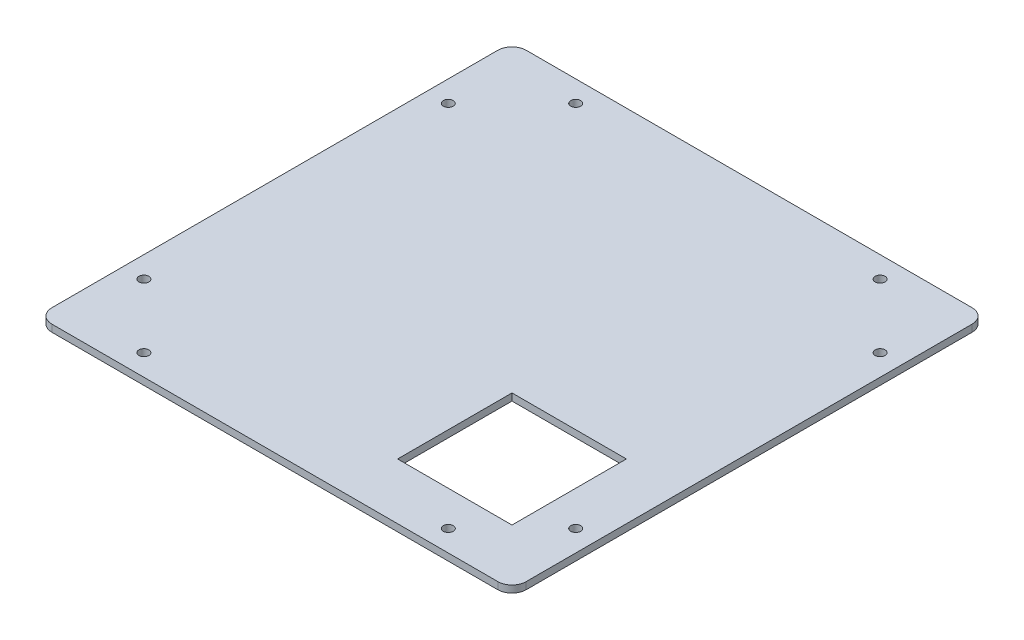
ISO-10303-21;
HEADER;
FILE_DESCRIPTION(('STEP AP214'),'2;1');
FILE_NAME('part.step','',(''),(''),'','','');
FILE_SCHEMA(('AUTOMOTIVE_DESIGN { 1 0 10303 214 1 1 1 1 }'));
ENDSEC;
DATA;
#1=APPLICATION_CONTEXT('core data for automotive mechanical design processes');
#2=APPLICATION_PROTOCOL_DEFINITION('international standard','automotive_design',2000,#1);
#3=PRODUCT_CONTEXT('',#1,'mechanical');
#4=PRODUCT('Part','Part','',(#3));
#5=PRODUCT_RELATED_PRODUCT_CATEGORY('part','',(#4));
#6=PRODUCT_DEFINITION_FORMATION('','',#4);
#7=PRODUCT_DEFINITION_CONTEXT('part definition',#1,'design');
#8=PRODUCT_DEFINITION('design','',#6,#7);
#9=PRODUCT_DEFINITION_SHAPE('','',#8);
#10=(LENGTH_UNIT() NAMED_UNIT(*) SI_UNIT(.MILLI.,.METRE.));
#11=(NAMED_UNIT(*) PLANE_ANGLE_UNIT() SI_UNIT($,.RADIAN.));
#12=(NAMED_UNIT(*) SI_UNIT($,.STERADIAN.) SOLID_ANGLE_UNIT());
#13=UNCERTAINTY_MEASURE_WITH_UNIT(LENGTH_MEASURE(1.E-05),#10,'distance_accuracy_value','');
#14=(GEOMETRIC_REPRESENTATION_CONTEXT(3) GLOBAL_UNCERTAINTY_ASSIGNED_CONTEXT((#13)) GLOBAL_UNIT_ASSIGNED_CONTEXT((#10,
#11,#12)) REPRESENTATION_CONTEXT('',''));
#15=CARTESIAN_POINT('',(0.,0.,0.));
#16=DIRECTION('',(0.,0.,1.));
#17=DIRECTION('',(1.,0.,0.));
#18=AXIS2_PLACEMENT_3D('',#15,#16,#17);
#19=CARTESIAN_POINT('',(212.725,6.35,212.725));
#20=DIRECTION('',(-1.,0.,0.));
#21=DIRECTION('',(0.,0.,1.));
#22=AXIS2_PLACEMENT_3D('',#19,#20,#21);
#23=PLANE('',#22);
#24=DIRECTION('',(0.,0.,-1.));
#25=VECTOR('',#24,1.);
#26=CARTESIAN_POINT('',(212.725,6.35,212.725));
#27=LINE('',#26,#25);
#28=CARTESIAN_POINT('',(212.725,6.35,200.025));
#29=VERTEX_POINT('',#28);
#30=CARTESIAN_POINT('',(212.725,6.35,-200.025));
#31=VERTEX_POINT('',#30);
#32=EDGE_CURVE('E217',#29,#31,#27,.T.);
#33=ORIENTED_EDGE('',*,*,#32,.F.);
#34=DIRECTION('',(0.,-1.,0.));
#35=VECTOR('',#34,1.);
#36=CARTESIAN_POINT('',(212.725,6.35,200.025));
#37=LINE('',#36,#35);
#38=CARTESIAN_POINT('',(212.725,0.,200.025));
#39=VERTEX_POINT('',#38);
#40=EDGE_CURVE('E239',#29,#39,#37,.T.);
#41=ORIENTED_EDGE('',*,*,#40,.T.);
#42=DIRECTION('',(0.,0.,-1.));
#43=VECTOR('',#42,1.);
#44=CARTESIAN_POINT('',(212.725,0.,212.725));
#45=LINE('',#44,#43);
#46=CARTESIAN_POINT('',(212.725,0.,-200.025));
#47=VERTEX_POINT('',#46);
#48=EDGE_CURVE('E214',#39,#47,#45,.T.);
#49=ORIENTED_EDGE('',*,*,#48,.T.);
#50=DIRECTION('',(0.,-1.,0.));
#51=VECTOR('',#50,1.);
#52=CARTESIAN_POINT('',(212.725,6.35,-200.025));
#53=LINE('',#52,#51);
#54=EDGE_CURVE('E228',#47,#31,#53,.F.);
#55=ORIENTED_EDGE('',*,*,#54,.T.);
#56=EDGE_LOOP('',(#33,#41,#49,#55));
#57=FACE_BOUND('',#56,.T.);
#58=ADVANCED_FACE('F35',(#57),#23,.F.);
#59=CARTESIAN_POINT('',(-212.725,6.35,-212.725));
#60=DIRECTION('',(0.,0.,1.));
#61=DIRECTION('',(1.,0.,0.));
#62=AXIS2_PLACEMENT_3D('',#59,#60,#61);
#63=PLANE('',#62);
#64=DIRECTION('',(-1.,0.,0.));
#65=VECTOR('',#64,1.);
#66=CARTESIAN_POINT('',(-212.725,6.35,-212.725));
#67=LINE('',#66,#65);
#68=CARTESIAN_POINT('',(200.025,6.35,-212.725));
#69=VERTEX_POINT('',#68);
#70=CARTESIAN_POINT('',(-200.025,6.35,-212.725));
#71=VERTEX_POINT('',#70);
#72=EDGE_CURVE('E220',#69,#71,#67,.T.);
#73=ORIENTED_EDGE('',*,*,#72,.F.);
#74=DIRECTION('',(0.,-1.,0.));
#75=VECTOR('',#74,1.);
#76=CARTESIAN_POINT('',(200.025,6.35,-212.725));
#77=LINE('',#76,#75);
#78=CARTESIAN_POINT('',(200.025,0.,-212.725));
#79=VERTEX_POINT('',#78);
#80=EDGE_CURVE('E264',#69,#79,#77,.T.);
#81=ORIENTED_EDGE('',*,*,#80,.T.);
#82=DIRECTION('',(-1.,0.,0.));
#83=VECTOR('',#82,1.);
#84=CARTESIAN_POINT('',(-212.725,0.,-212.725));
#85=LINE('',#84,#83);
#86=CARTESIAN_POINT('',(-200.025,0.,-212.725));
#87=VERTEX_POINT('',#86);
#88=EDGE_CURVE('E231',#79,#87,#85,.T.);
#89=ORIENTED_EDGE('',*,*,#88,.T.);
#90=DIRECTION('',(0.,-1.,0.));
#91=VECTOR('',#90,1.);
#92=CARTESIAN_POINT('',(-200.025,6.35,-212.725));
#93=LINE('',#92,#91);
#94=EDGE_CURVE('E262',#87,#71,#93,.F.);
#95=ORIENTED_EDGE('',*,*,#94,.T.);
#96=EDGE_LOOP('',(#73,#81,#89,#95));
#97=FACE_BOUND('',#96,.T.);
#98=ADVANCED_FACE('F270',(#97),#63,.F.);
#99=CARTESIAN_POINT('',(-212.725,6.35,212.725));
#100=DIRECTION('',(1.,0.,0.));
#101=DIRECTION('',(0.,0.,-1.));
#102=AXIS2_PLACEMENT_3D('',#99,#100,#101);
#103=PLANE('',#102);
#104=DIRECTION('',(0.,0.,1.));
#105=VECTOR('',#104,1.);
#106=CARTESIAN_POINT('',(-212.725,6.35,212.725));
#107=LINE('',#106,#105);
#108=CARTESIAN_POINT('',(-212.725,6.35,-200.025));
#109=VERTEX_POINT('',#108);
#110=CARTESIAN_POINT('',(-212.725,6.35,200.025));
#111=VERTEX_POINT('',#110);
#112=EDGE_CURVE('E223',#109,#111,#107,.T.);
#113=ORIENTED_EDGE('',*,*,#112,.F.);
#114=DIRECTION('',(0.,-1.,0.));
#115=VECTOR('',#114,1.);
#116=CARTESIAN_POINT('',(-212.725,6.35,-200.025));
#117=LINE('',#116,#115);
#118=CARTESIAN_POINT('',(-212.725,0.,-200.025));
#119=VERTEX_POINT('',#118);
#120=EDGE_CURVE('E11',#109,#119,#117,.T.);
#121=ORIENTED_EDGE('',*,*,#120,.T.);
#122=DIRECTION('',(0.,0.,1.));
#123=VECTOR('',#122,1.);
#124=CARTESIAN_POINT('',(-212.725,0.,212.725));
#125=LINE('',#124,#123);
#126=CARTESIAN_POINT('',(-212.725,0.,200.025));
#127=VERTEX_POINT('',#126);
#128=EDGE_CURVE('E234',#119,#127,#125,.T.);
#129=ORIENTED_EDGE('',*,*,#128,.T.);
#130=DIRECTION('',(0.,-1.,0.));
#131=VECTOR('',#130,1.);
#132=CARTESIAN_POINT('',(-212.725,6.35,200.025));
#133=LINE('',#132,#131);
#134=EDGE_CURVE('E43',#127,#111,#133,.F.);
#135=ORIENTED_EDGE('',*,*,#134,.T.);
#136=EDGE_LOOP('',(#113,#121,#129,#135));
#137=FACE_BOUND('',#136,.T.);
#138=ADVANCED_FACE('F280',(#137),#103,.F.);
#139=CARTESIAN_POINT('',(-212.725,6.35,212.725));
#140=DIRECTION('',(0.,0.,-1.));
#141=DIRECTION('',(-1.,0.,0.));
#142=AXIS2_PLACEMENT_3D('',#139,#140,#141);
#143=PLANE('',#142);
#144=DIRECTION('',(1.,0.,0.));
#145=VECTOR('',#144,1.);
#146=CARTESIAN_POINT('',(-212.725,0.,212.725));
#147=LINE('',#146,#145);
#148=CARTESIAN_POINT('',(-200.025,0.,212.725));
#149=VERTEX_POINT('',#148);
#150=CARTESIAN_POINT('',(200.025,0.,212.725));
#151=VERTEX_POINT('',#150);
#152=EDGE_CURVE('E221',#149,#151,#147,.T.);
#153=ORIENTED_EDGE('',*,*,#152,.T.);
#154=DIRECTION('',(0.,-1.,0.));
#155=VECTOR('',#154,1.);
#156=CARTESIAN_POINT('',(200.025,6.35,212.725));
#157=LINE('',#156,#155);
#158=CARTESIAN_POINT('',(200.025,6.35,212.725));
#159=VERTEX_POINT('',#158);
#160=EDGE_CURVE('E253',#151,#159,#157,.F.);
#161=ORIENTED_EDGE('',*,*,#160,.T.);
#162=DIRECTION('',(1.,0.,0.));
#163=VECTOR('',#162,1.);
#164=CARTESIAN_POINT('',(-212.725,6.35,212.725));
#165=LINE('',#164,#163);
#166=CARTESIAN_POINT('',(-200.025,6.35,212.725));
#167=VERTEX_POINT('',#166);
#168=EDGE_CURVE('E225',#167,#159,#165,.T.);
#169=ORIENTED_EDGE('',*,*,#168,.F.);
#170=DIRECTION('',(0.,-1.,0.));
#171=VECTOR('',#170,1.);
#172=CARTESIAN_POINT('',(-200.025,6.35,212.725));
#173=LINE('',#172,#171);
#174=EDGE_CURVE('E250',#167,#149,#173,.T.);
#175=ORIENTED_EDGE('',*,*,#174,.T.);
#176=EDGE_LOOP('',(#153,#161,#169,#175));
#177=FACE_BOUND('',#176,.T.);
#178=ADVANCED_FACE('F288',(#177),#143,.F.);
#179=CARTESIAN_POINT('',(0.,6.35,0.));
#180=DIRECTION('',(0.,-1.,0.));
#181=DIRECTION('',(0.,0.,-1.));
#182=AXIS2_PLACEMENT_3D('',#179,#180,#181);
#183=PLANE('',#182);
#184=DIRECTION('',(-1.,0.,0.));
#185=VECTOR('',#184,1.);
#186=CARTESIAN_POINT('',(59.817,6.35,59.817));
#187=LINE('',#186,#185);
#188=CARTESIAN_POINT('',(162.433,6.35,59.817));
#189=VERTEX_POINT('',#188);
#190=CARTESIAN_POINT('',(59.817,6.35,59.817));
#191=VERTEX_POINT('',#190);
#192=EDGE_CURVE('E159',#189,#191,#187,.T.);
#193=ORIENTED_EDGE('',*,*,#192,.F.);
#194=DIRECTION('',(0.,0.,-1.));
#195=VECTOR('',#194,1.);
#196=CARTESIAN_POINT('',(162.433,6.35,59.817));
#197=LINE('',#196,#195);
#198=CARTESIAN_POINT('',(162.433,6.35,162.433));
#199=VERTEX_POINT('',#198);
#200=EDGE_CURVE('E132',#199,#189,#197,.T.);
#201=ORIENTED_EDGE('',*,*,#200,.F.);
#202=DIRECTION('',(1.,0.,0.));
#203=VECTOR('',#202,1.);
#204=CARTESIAN_POINT('',(59.817,6.35,162.433));
#205=LINE('',#204,#203);
#206=CARTESIAN_POINT('',(59.817,6.35,162.433));
#207=VERTEX_POINT('',#206);
#208=EDGE_CURVE('E150',#207,#199,#205,.T.);
#209=ORIENTED_EDGE('',*,*,#208,.F.);
#210=DIRECTION('',(0.,0.,1.));
#211=VECTOR('',#210,1.);
#212=CARTESIAN_POINT('',(59.817,6.35,59.817));
#213=LINE('',#212,#211);
#214=EDGE_CURVE('E153',#191,#207,#213,.T.);
#215=ORIENTED_EDGE('',*,*,#214,.F.);
#216=EDGE_LOOP('',(#193,#201,#209,#215));
#217=FACE_BOUND('',#216,.T.);
#218=CARTESIAN_POINT('',(-136.525,6.35,-193.675));
#219=DIRECTION('',(0.,1.,0.));
#220=DIRECTION('',(0.,0.,-1.));
#221=AXIS2_PLACEMENT_3D('',#218,#219,#220);
#222=CIRCLE('',#221,4.445);
#223=CARTESIAN_POINT('',(-136.525,6.35,-198.12));
#224=VERTEX_POINT('',#223);
#225=EDGE_CURVE('E165',#224,#224,#222,.T.);
#226=ORIENTED_EDGE('',*,*,#225,.F.);
#227=EDGE_LOOP('',(#226));
#228=FACE_BOUND('',#227,.T.);
#229=CARTESIAN_POINT('',(136.525,6.35,-193.675));
#230=DIRECTION('',(0.,1.,0.));
#231=DIRECTION('',(0.,0.,-1.));
#232=AXIS2_PLACEMENT_3D('',#229,#230,#231);
#233=CIRCLE('',#232,4.44499999999997);
#234=CARTESIAN_POINT('',(136.525,6.35,-198.12));
#235=VERTEX_POINT('',#234);
#236=EDGE_CURVE('E185',#235,#235,#233,.T.);
#237=ORIENTED_EDGE('',*,*,#236,.F.);
#238=EDGE_LOOP('',(#237));
#239=FACE_BOUND('',#238,.T.);
#240=CARTESIAN_POINT('',(193.675,6.35,-136.525));
#241=DIRECTION('',(0.,1.,0.));
#242=DIRECTION('',(0.,0.,-1.));
#243=AXIS2_PLACEMENT_3D('',#240,#241,#242);
#244=CIRCLE('',#243,4.44499999999992);
#245=CARTESIAN_POINT('',(193.675,6.35,-140.97));
#246=VERTEX_POINT('',#245);
#247=EDGE_CURVE('E179',#246,#246,#244,.T.);
#248=ORIENTED_EDGE('',*,*,#247,.F.);
#249=EDGE_LOOP('',(#248));
#250=FACE_BOUND('',#249,.T.);
#251=CARTESIAN_POINT('',(193.675,6.35,136.525));
#252=DIRECTION('',(0.,1.,0.));
#253=DIRECTION('',(0.,0.,-1.));
#254=AXIS2_PLACEMENT_3D('',#251,#252,#253);
#255=CIRCLE('',#254,4.44499999999993);
#256=CARTESIAN_POINT('',(193.675,6.35,132.08));
#257=VERTEX_POINT('',#256);
#258=EDGE_CURVE('E173',#257,#257,#255,.T.);
#259=ORIENTED_EDGE('',*,*,#258,.F.);
#260=EDGE_LOOP('',(#259));
#261=FACE_BOUND('',#260,.T.);
#262=CARTESIAN_POINT('',(136.525,6.35,193.675));
#263=DIRECTION('',(0.,1.,0.));
#264=DIRECTION('',(0.,0.,1.));
#265=AXIS2_PLACEMENT_3D('',#262,#263,#264);
#266=CIRCLE('',#265,4.445);
#267=CARTESIAN_POINT('',(136.525,6.35,198.12));
#268=VERTEX_POINT('',#267);
#269=EDGE_CURVE('E172',#268,#268,#266,.T.);
#270=ORIENTED_EDGE('',*,*,#269,.F.);
#271=EDGE_LOOP('',(#270));
#272=FACE_BOUND('',#271,.T.);
#273=CARTESIAN_POINT('',(-136.525,6.35,193.675));
#274=DIRECTION('',(0.,1.,0.));
#275=DIRECTION('',(0.,0.,1.));
#276=AXIS2_PLACEMENT_3D('',#273,#274,#275);
#277=CIRCLE('',#276,4.445);
#278=CARTESIAN_POINT('',(-136.525,6.35,198.12));
#279=VERTEX_POINT('',#278);
#280=EDGE_CURVE('E203',#279,#279,#277,.T.);
#281=ORIENTED_EDGE('',*,*,#280,.F.);
#282=EDGE_LOOP('',(#281));
#283=FACE_BOUND('',#282,.T.);
#284=CARTESIAN_POINT('',(-193.675,6.35,136.525));
#285=DIRECTION('',(0.,1.,0.));
#286=DIRECTION('',(0.,0.,1.));
#287=AXIS2_PLACEMENT_3D('',#284,#285,#286);
#288=CIRCLE('',#287,4.445);
#289=CARTESIAN_POINT('',(-193.675,6.35,140.97));
#290=VERTEX_POINT('',#289);
#291=EDGE_CURVE('E197',#290,#290,#288,.T.);
#292=ORIENTED_EDGE('',*,*,#291,.F.);
#293=EDGE_LOOP('',(#292));
#294=FACE_BOUND('',#293,.T.);
#295=CARTESIAN_POINT('',(-193.675,6.35,-136.525));
#296=DIRECTION('',(0.,1.,0.));
#297=DIRECTION('',(0.,0.,1.));
#298=AXIS2_PLACEMENT_3D('',#295,#296,#297);
#299=CIRCLE('',#298,4.445);
#300=CARTESIAN_POINT('',(-193.675,6.35,-132.08));
#301=VERTEX_POINT('',#300);
#302=EDGE_CURVE('E196',#301,#301,#299,.T.);
#303=ORIENTED_EDGE('',*,*,#302,.F.);
#304=EDGE_LOOP('',(#303));
#305=FACE_BOUND('',#304,.T.);
#306=ORIENTED_EDGE('',*,*,#168,.T.);
#307=CARTESIAN_POINT('',(200.025,6.35,200.025));
#308=DIRECTION('',(0.,-1.,0.));
#309=DIRECTION('',(0.,0.,-1.));
#310=AXIS2_PLACEMENT_3D('',#307,#308,#309);
#311=CIRCLE('',#310,12.7);
#312=EDGE_CURVE('E260',#159,#29,#311,.F.);
#313=ORIENTED_EDGE('',*,*,#312,.T.);
#314=ORIENTED_EDGE('',*,*,#32,.T.);
#315=CARTESIAN_POINT('',(200.025,6.35,-200.025));
#316=DIRECTION('',(0.,-1.,0.));
#317=DIRECTION('',(0.,0.,-1.));
#318=AXIS2_PLACEMENT_3D('',#315,#316,#317);
#319=CIRCLE('',#318,12.7);
#320=EDGE_CURVE('E258',#31,#69,#319,.F.);
#321=ORIENTED_EDGE('',*,*,#320,.T.);
#322=ORIENTED_EDGE('',*,*,#72,.T.);
#323=CARTESIAN_POINT('',(-200.025,6.35,-200.025));
#324=DIRECTION('',(0.,-1.,0.));
#325=DIRECTION('',(0.,0.,-1.));
#326=AXIS2_PLACEMENT_3D('',#323,#324,#325);
#327=CIRCLE('',#326,12.7);
#328=EDGE_CURVE('E56',#71,#109,#327,.F.);
#329=ORIENTED_EDGE('',*,*,#328,.T.);
#330=ORIENTED_EDGE('',*,*,#112,.T.);
#331=CARTESIAN_POINT('',(-200.025,6.35,200.025));
#332=DIRECTION('',(0.,-1.,0.));
#333=DIRECTION('',(0.,0.,-1.));
#334=AXIS2_PLACEMENT_3D('',#331,#332,#333);
#335=CIRCLE('',#334,12.7);
#336=EDGE_CURVE('E255',#111,#167,#335,.F.);
#337=ORIENTED_EDGE('',*,*,#336,.T.);
#338=EDGE_LOOP('',(#306,#313,#314,#321,#322,#329,#330,#337));
#339=FACE_BOUND('',#338,.T.);
#340=ADVANCED_FACE('F282',(#217,#228,#239,#250,#261,#272,#283,#294,#305,#339),#183,.F.);
#341=CARTESIAN_POINT('',(0.,0.,0.));
#342=DIRECTION('',(0.,-1.,0.));
#343=DIRECTION('',(0.,0.,-1.));
#344=AXIS2_PLACEMENT_3D('',#341,#342,#343);
#345=PLANE('',#344);
#346=DIRECTION('',(0.,0.,-1.));
#347=VECTOR('',#346,1.);
#348=CARTESIAN_POINT('',(162.433,0.,59.817));
#349=LINE('',#348,#347);
#350=CARTESIAN_POINT('',(162.433,0.,162.433));
#351=VERTEX_POINT('',#350);
#352=CARTESIAN_POINT('',(162.433,0.,59.817));
#353=VERTEX_POINT('',#352);
#354=EDGE_CURVE('E129',#351,#353,#349,.T.);
#355=ORIENTED_EDGE('',*,*,#354,.T.);
#356=DIRECTION('',(-1.,0.,0.));
#357=VECTOR('',#356,1.);
#358=CARTESIAN_POINT('',(59.817,0.,59.817));
#359=LINE('',#358,#357);
#360=CARTESIAN_POINT('',(59.817,0.,59.817));
#361=VERTEX_POINT('',#360);
#362=EDGE_CURVE('E141',#353,#361,#359,.T.);
#363=ORIENTED_EDGE('',*,*,#362,.T.);
#364=DIRECTION('',(0.,0.,1.));
#365=VECTOR('',#364,1.);
#366=CARTESIAN_POINT('',(59.817,0.,59.817));
#367=LINE('',#366,#365);
#368=CARTESIAN_POINT('',(59.817,0.,162.433));
#369=VERTEX_POINT('',#368);
#370=EDGE_CURVE('E145',#361,#369,#367,.T.);
#371=ORIENTED_EDGE('',*,*,#370,.T.);
#372=DIRECTION('',(1.,0.,0.));
#373=VECTOR('',#372,1.);
#374=CARTESIAN_POINT('',(59.817,0.,162.433));
#375=LINE('',#374,#373);
#376=EDGE_CURVE('E137',#369,#351,#375,.T.);
#377=ORIENTED_EDGE('',*,*,#376,.T.);
#378=EDGE_LOOP('',(#355,#363,#371,#377));
#379=FACE_BOUND('',#378,.T.);
#380=CARTESIAN_POINT('',(-136.525,0.,-193.675));
#381=DIRECTION('',(0.,1.,0.));
#382=DIRECTION('',(0.,0.,-1.));
#383=AXIS2_PLACEMENT_3D('',#380,#381,#382);
#384=CIRCLE('',#383,4.445);
#385=CARTESIAN_POINT('',(-136.525,0.,-198.12));
#386=VERTEX_POINT('',#385);
#387=EDGE_CURVE('E188',#386,#386,#384,.T.);
#388=ORIENTED_EDGE('',*,*,#387,.T.);
#389=EDGE_LOOP('',(#388));
#390=FACE_BOUND('',#389,.T.);
#391=CARTESIAN_POINT('',(136.525,0.,-193.675));
#392=DIRECTION('',(0.,1.,0.));
#393=DIRECTION('',(0.,0.,-1.));
#394=AXIS2_PLACEMENT_3D('',#391,#392,#393);
#395=CIRCLE('',#394,4.44499999999997);
#396=CARTESIAN_POINT('',(136.525,0.,-198.12));
#397=VERTEX_POINT('',#396);
#398=EDGE_CURVE('E182',#397,#397,#395,.T.);
#399=ORIENTED_EDGE('',*,*,#398,.T.);
#400=EDGE_LOOP('',(#399));
#401=FACE_BOUND('',#400,.T.);
#402=CARTESIAN_POINT('',(193.675,0.,-136.525));
#403=DIRECTION('',(0.,1.,0.));
#404=DIRECTION('',(0.,0.,-1.));
#405=AXIS2_PLACEMENT_3D('',#402,#403,#404);
#406=CIRCLE('',#405,4.44499999999992);
#407=CARTESIAN_POINT('',(193.675,0.,-140.97));
#408=VERTEX_POINT('',#407);
#409=EDGE_CURVE('E176',#408,#408,#406,.T.);
#410=ORIENTED_EDGE('',*,*,#409,.T.);
#411=EDGE_LOOP('',(#410));
#412=FACE_BOUND('',#411,.T.);
#413=CARTESIAN_POINT('',(193.675,0.,136.525));
#414=DIRECTION('',(0.,1.,0.));
#415=DIRECTION('',(0.,0.,-1.));
#416=AXIS2_PLACEMENT_3D('',#413,#414,#415);
#417=CIRCLE('',#416,4.44499999999993);
#418=CARTESIAN_POINT('',(193.675,0.,132.08));
#419=VERTEX_POINT('',#418);
#420=EDGE_CURVE('E169',#419,#419,#417,.T.);
#421=ORIENTED_EDGE('',*,*,#420,.T.);
#422=EDGE_LOOP('',(#421));
#423=FACE_BOUND('',#422,.T.);
#424=CARTESIAN_POINT('',(136.525,0.,193.675));
#425=DIRECTION('',(0.,1.,0.));
#426=DIRECTION('',(0.,0.,1.));
#427=AXIS2_PLACEMENT_3D('',#424,#425,#426);
#428=CIRCLE('',#427,4.445);
#429=CARTESIAN_POINT('',(136.525,0.,198.12));
#430=VERTEX_POINT('',#429);
#431=EDGE_CURVE('E206',#430,#430,#428,.T.);
#432=ORIENTED_EDGE('',*,*,#431,.T.);
#433=EDGE_LOOP('',(#432));
#434=FACE_BOUND('',#433,.T.);
#435=CARTESIAN_POINT('',(-136.525,0.,193.675));
#436=DIRECTION('',(0.,1.,0.));
#437=DIRECTION('',(0.,0.,1.));
#438=AXIS2_PLACEMENT_3D('',#435,#436,#437);
#439=CIRCLE('',#438,4.445);
#440=CARTESIAN_POINT('',(-136.525,0.,198.12));
#441=VERTEX_POINT('',#440);
#442=EDGE_CURVE('E200',#441,#441,#439,.T.);
#443=ORIENTED_EDGE('',*,*,#442,.T.);
#444=EDGE_LOOP('',(#443));
#445=FACE_BOUND('',#444,.T.);
#446=CARTESIAN_POINT('',(-193.675,0.,136.525));
#447=DIRECTION('',(0.,1.,0.));
#448=DIRECTION('',(0.,0.,1.));
#449=AXIS2_PLACEMENT_3D('',#446,#447,#448);
#450=CIRCLE('',#449,4.445);
#451=CARTESIAN_POINT('',(-193.675,0.,140.97));
#452=VERTEX_POINT('',#451);
#453=EDGE_CURVE('E193',#452,#452,#450,.T.);
#454=ORIENTED_EDGE('',*,*,#453,.T.);
#455=EDGE_LOOP('',(#454));
#456=FACE_BOUND('',#455,.T.);
#457=CARTESIAN_POINT('',(-193.675,0.,-136.525));
#458=DIRECTION('',(0.,1.,0.));
#459=DIRECTION('',(0.,0.,1.));
#460=AXIS2_PLACEMENT_3D('',#457,#458,#459);
#461=CIRCLE('',#460,4.445);
#462=CARTESIAN_POINT('',(-193.675,0.,-132.08));
#463=VERTEX_POINT('',#462);
#464=EDGE_CURVE('E211',#463,#463,#461,.T.);
#465=ORIENTED_EDGE('',*,*,#464,.T.);
#466=EDGE_LOOP('',(#465));
#467=FACE_BOUND('',#466,.T.);
#468=ORIENTED_EDGE('',*,*,#48,.F.);
#469=CARTESIAN_POINT('',(200.025,0.,200.025));
#470=DIRECTION('',(0.,-1.,0.));
#471=DIRECTION('',(0.,0.,-1.));
#472=AXIS2_PLACEMENT_3D('',#469,#470,#471);
#473=CIRCLE('',#472,12.7);
#474=EDGE_CURVE('E248',#39,#151,#473,.T.);
#475=ORIENTED_EDGE('',*,*,#474,.T.);
#476=ORIENTED_EDGE('',*,*,#152,.F.);
#477=CARTESIAN_POINT('',(-200.025,0.,200.025));
#478=DIRECTION('',(0.,-1.,0.));
#479=DIRECTION('',(0.,0.,-1.));
#480=AXIS2_PLACEMENT_3D('',#477,#478,#479);
#481=CIRCLE('',#480,12.7);
#482=EDGE_CURVE('E242',#149,#127,#481,.T.);
#483=ORIENTED_EDGE('',*,*,#482,.T.);
#484=ORIENTED_EDGE('',*,*,#128,.F.);
#485=CARTESIAN_POINT('',(-200.025,0.,-200.025));
#486=DIRECTION('',(0.,-1.,0.));
#487=DIRECTION('',(0.,0.,-1.));
#488=AXIS2_PLACEMENT_3D('',#485,#486,#487);
#489=CIRCLE('',#488,12.7);
#490=EDGE_CURVE('E244',#119,#87,#489,.T.);
#491=ORIENTED_EDGE('',*,*,#490,.T.);
#492=ORIENTED_EDGE('',*,*,#88,.F.);
#493=CARTESIAN_POINT('',(200.025,0.,-200.025));
#494=DIRECTION('',(0.,-1.,0.));
#495=DIRECTION('',(0.,0.,-1.));
#496=AXIS2_PLACEMENT_3D('',#493,#494,#495);
#497=CIRCLE('',#496,12.7);
#498=EDGE_CURVE('E246',#79,#47,#497,.T.);
#499=ORIENTED_EDGE('',*,*,#498,.T.);
#500=EDGE_LOOP('',(#468,#475,#476,#483,#484,#491,#492,#499));
#501=FACE_BOUND('',#500,.T.);
#502=ADVANCED_FACE('F147',(#379,#390,#401,#412,#423,#434,#445,#456,#467,#501),#345,.T.);
#503=CARTESIAN_POINT('',(-193.675,0.,-136.525));
#504=DIRECTION('',(0.,1.,0.));
#505=DIRECTION('',(0.,0.,1.));
#506=AXIS2_PLACEMENT_3D('',#503,#504,#505);
#507=CYLINDRICAL_SURFACE('',#506,4.445);
#508=ORIENTED_EDGE('',*,*,#464,.F.);
#509=EDGE_LOOP('',(#508));
#510=FACE_BOUND('',#509,.T.);
#511=ORIENTED_EDGE('',*,*,#302,.T.);
#512=EDGE_LOOP('',(#511));
#513=FACE_BOUND('',#512,.T.);
#514=ADVANCED_FACE('F318',(#510,#513),#507,.F.);
#515=CARTESIAN_POINT('',(-193.675,0.,136.525));
#516=DIRECTION('',(0.,1.,0.));
#517=DIRECTION('',(0.,0.,1.));
#518=AXIS2_PLACEMENT_3D('',#515,#516,#517);
#519=CYLINDRICAL_SURFACE('',#518,4.445);
#520=ORIENTED_EDGE('',*,*,#453,.F.);
#521=EDGE_LOOP('',(#520));
#522=FACE_BOUND('',#521,.T.);
#523=ORIENTED_EDGE('',*,*,#291,.T.);
#524=EDGE_LOOP('',(#523));
#525=FACE_BOUND('',#524,.T.);
#526=ADVANCED_FACE('F324',(#522,#525),#519,.F.);
#527=CARTESIAN_POINT('',(-136.525,0.,193.675));
#528=DIRECTION('',(0.,1.,0.));
#529=DIRECTION('',(0.,0.,1.));
#530=AXIS2_PLACEMENT_3D('',#527,#528,#529);
#531=CYLINDRICAL_SURFACE('',#530,4.445);
#532=ORIENTED_EDGE('',*,*,#442,.F.);
#533=EDGE_LOOP('',(#532));
#534=FACE_BOUND('',#533,.T.);
#535=ORIENTED_EDGE('',*,*,#280,.T.);
#536=EDGE_LOOP('',(#535));
#537=FACE_BOUND('',#536,.T.);
#538=ADVANCED_FACE('F330',(#534,#537),#531,.F.);
#539=CARTESIAN_POINT('',(136.525,0.,193.675));
#540=DIRECTION('',(0.,1.,0.));
#541=DIRECTION('',(0.,0.,1.));
#542=AXIS2_PLACEMENT_3D('',#539,#540,#541);
#543=CYLINDRICAL_SURFACE('',#542,4.445);
#544=ORIENTED_EDGE('',*,*,#431,.F.);
#545=EDGE_LOOP('',(#544));
#546=FACE_BOUND('',#545,.T.);
#547=ORIENTED_EDGE('',*,*,#269,.T.);
#548=EDGE_LOOP('',(#547));
#549=FACE_BOUND('',#548,.T.);
#550=ADVANCED_FACE('F326',(#546,#549),#543,.F.);
#551=CARTESIAN_POINT('',(193.675,0.,136.525));
#552=DIRECTION('',(0.,1.,0.));
#553=DIRECTION('',(0.,0.,1.));
#554=AXIS2_PLACEMENT_3D('',#551,#552,#553);
#555=CYLINDRICAL_SURFACE('',#554,4.44499999999993);
#556=ORIENTED_EDGE('',*,*,#420,.F.);
#557=EDGE_LOOP('',(#556));
#558=FACE_BOUND('',#557,.T.);
#559=ORIENTED_EDGE('',*,*,#258,.T.);
#560=EDGE_LOOP('',(#559));
#561=FACE_BOUND('',#560,.T.);
#562=ADVANCED_FACE('F329',(#558,#561),#555,.F.);
#563=CARTESIAN_POINT('',(193.675,0.,-136.525));
#564=DIRECTION('',(0.,1.,0.));
#565=DIRECTION('',(0.,0.,1.));
#566=AXIS2_PLACEMENT_3D('',#563,#564,#565);
#567=CYLINDRICAL_SURFACE('',#566,4.44499999999992);
#568=ORIENTED_EDGE('',*,*,#409,.F.);
#569=EDGE_LOOP('',(#568));
#570=FACE_BOUND('',#569,.T.);
#571=ORIENTED_EDGE('',*,*,#247,.T.);
#572=EDGE_LOOP('',(#571));
#573=FACE_BOUND('',#572,.T.);
#574=ADVANCED_FACE('F345',(#570,#573),#567,.F.);
#575=CARTESIAN_POINT('',(136.525,0.,-193.675));
#576=DIRECTION('',(0.,1.,0.));
#577=DIRECTION('',(0.,0.,1.));
#578=AXIS2_PLACEMENT_3D('',#575,#576,#577);
#579=CYLINDRICAL_SURFACE('',#578,4.44499999999997);
#580=ORIENTED_EDGE('',*,*,#398,.F.);
#581=EDGE_LOOP('',(#580));
#582=FACE_BOUND('',#581,.T.);
#583=ORIENTED_EDGE('',*,*,#236,.T.);
#584=EDGE_LOOP('',(#583));
#585=FACE_BOUND('',#584,.T.);
#586=ADVANCED_FACE('F341',(#582,#585),#579,.F.);
#587=CARTESIAN_POINT('',(-136.525,0.,-193.675));
#588=DIRECTION('',(0.,1.,0.));
#589=DIRECTION('',(0.,0.,1.));
#590=AXIS2_PLACEMENT_3D('',#587,#588,#589);
#591=CYLINDRICAL_SURFACE('',#590,4.445);
#592=ORIENTED_EDGE('',*,*,#387,.F.);
#593=EDGE_LOOP('',(#592));
#594=FACE_BOUND('',#593,.T.);
#595=ORIENTED_EDGE('',*,*,#225,.T.);
#596=EDGE_LOOP('',(#595));
#597=FACE_BOUND('',#596,.T.);
#598=ADVANCED_FACE('F338',(#594,#597),#591,.F.);
#599=CARTESIAN_POINT('',(162.433,0.,59.817));
#600=DIRECTION('',(1.,0.,0.));
#601=DIRECTION('',(0.,0.,-1.));
#602=AXIS2_PLACEMENT_3D('',#599,#600,#601);
#603=PLANE('',#602);
#604=ORIENTED_EDGE('',*,*,#200,.T.);
#605=DIRECTION('',(0.,1.,0.));
#606=VECTOR('',#605,1.);
#607=CARTESIAN_POINT('',(162.433,0.,59.817));
#608=LINE('',#607,#606);
#609=EDGE_CURVE('E125',#353,#189,#608,.T.);
#610=ORIENTED_EDGE('',*,*,#609,.F.);
#611=ORIENTED_EDGE('',*,*,#354,.F.);
#612=DIRECTION('',(0.,1.,0.));
#613=VECTOR('',#612,1.);
#614=CARTESIAN_POINT('',(162.433,0.,162.433));
#615=LINE('',#614,#613);
#616=EDGE_CURVE('E163',#351,#199,#615,.T.);
#617=ORIENTED_EDGE('',*,*,#616,.T.);
#618=EDGE_LOOP('',(#604,#610,#611,#617));
#619=FACE_BOUND('',#618,.T.);
#620=ADVANCED_FACE('F127',(#619),#603,.F.);
#621=CARTESIAN_POINT('',(59.817,0.,162.433));
#622=DIRECTION('',(0.,0.,1.));
#623=DIRECTION('',(1.,0.,0.));
#624=AXIS2_PLACEMENT_3D('',#621,#622,#623);
#625=PLANE('',#624);
#626=ORIENTED_EDGE('',*,*,#208,.T.);
#627=ORIENTED_EDGE('',*,*,#616,.F.);
#628=ORIENTED_EDGE('',*,*,#376,.F.);
#629=DIRECTION('',(0.,1.,0.));
#630=VECTOR('',#629,1.);
#631=CARTESIAN_POINT('',(59.817,0.,162.433));
#632=LINE('',#631,#630);
#633=EDGE_CURVE('E166',#369,#207,#632,.T.);
#634=ORIENTED_EDGE('',*,*,#633,.T.);
#635=EDGE_LOOP('',(#626,#627,#628,#634));
#636=FACE_BOUND('',#635,.T.);
#637=ADVANCED_FACE('F355',(#636),#625,.F.);
#638=CARTESIAN_POINT('',(59.817,0.,59.817));
#639=DIRECTION('',(-1.,0.,0.));
#640=DIRECTION('',(0.,0.,1.));
#641=AXIS2_PLACEMENT_3D('',#638,#639,#640);
#642=PLANE('',#641);
#643=ORIENTED_EDGE('',*,*,#214,.T.);
#644=ORIENTED_EDGE('',*,*,#633,.F.);
#645=ORIENTED_EDGE('',*,*,#370,.F.);
#646=DIRECTION('',(0.,1.,0.));
#647=VECTOR('',#646,1.);
#648=CARTESIAN_POINT('',(59.817,0.,59.817));
#649=LINE('',#648,#647);
#650=EDGE_CURVE('E136',#361,#191,#649,.T.);
#651=ORIENTED_EDGE('',*,*,#650,.T.);
#652=EDGE_LOOP('',(#643,#644,#645,#651));
#653=FACE_BOUND('',#652,.T.);
#654=ADVANCED_FACE('F358',(#653),#642,.F.);
#655=CARTESIAN_POINT('',(59.817,0.,59.817));
#656=DIRECTION('',(0.,0.,-1.));
#657=DIRECTION('',(-1.,0.,0.));
#658=AXIS2_PLACEMENT_3D('',#655,#656,#657);
#659=PLANE('',#658);
#660=ORIENTED_EDGE('',*,*,#192,.T.);
#661=ORIENTED_EDGE('',*,*,#650,.F.);
#662=ORIENTED_EDGE('',*,*,#362,.F.);
#663=ORIENTED_EDGE('',*,*,#609,.T.);
#664=EDGE_LOOP('',(#660,#661,#662,#663));
#665=FACE_BOUND('',#664,.T.);
#666=ADVANCED_FACE('F142',(#665),#659,.F.);
#667=CARTESIAN_POINT('',(200.025,6.35,200.025));
#668=DIRECTION('',(0.,-1.,0.));
#669=DIRECTION('',(0.,0.,-1.));
#670=AXIS2_PLACEMENT_3D('',#667,#668,#669);
#671=CYLINDRICAL_SURFACE('',#670,12.7);
#672=ORIENTED_EDGE('',*,*,#312,.F.);
#673=ORIENTED_EDGE('',*,*,#160,.F.);
#674=ORIENTED_EDGE('',*,*,#474,.F.);
#675=ORIENTED_EDGE('',*,*,#40,.F.);
#676=EDGE_LOOP('',(#672,#673,#674,#675));
#677=FACE_BOUND('',#676,.T.);
#678=ADVANCED_FACE('F293',(#677),#671,.T.);
#679=CARTESIAN_POINT('',(200.025,6.35,-200.025));
#680=DIRECTION('',(0.,-1.,0.));
#681=DIRECTION('',(0.,0.,-1.));
#682=AXIS2_PLACEMENT_3D('',#679,#680,#681);
#683=CYLINDRICAL_SURFACE('',#682,12.7);
#684=ORIENTED_EDGE('',*,*,#320,.F.);
#685=ORIENTED_EDGE('',*,*,#54,.F.);
#686=ORIENTED_EDGE('',*,*,#498,.F.);
#687=ORIENTED_EDGE('',*,*,#80,.F.);
#688=EDGE_LOOP('',(#684,#685,#686,#687));
#689=FACE_BOUND('',#688,.T.);
#690=ADVANCED_FACE('F297',(#689),#683,.T.);
#691=CARTESIAN_POINT('',(-200.025,6.35,-200.025));
#692=DIRECTION('',(0.,-1.,0.));
#693=DIRECTION('',(0.,0.,-1.));
#694=AXIS2_PLACEMENT_3D('',#691,#692,#693);
#695=CYLINDRICAL_SURFACE('',#694,12.7);
#696=ORIENTED_EDGE('',*,*,#328,.F.);
#697=ORIENTED_EDGE('',*,*,#94,.F.);
#698=ORIENTED_EDGE('',*,*,#490,.F.);
#699=ORIENTED_EDGE('',*,*,#120,.F.);
#700=EDGE_LOOP('',(#696,#697,#698,#699));
#701=FACE_BOUND('',#700,.T.);
#702=ADVANCED_FACE('F279',(#701),#695,.T.);
#703=CARTESIAN_POINT('',(-200.025,6.35,200.025));
#704=DIRECTION('',(0.,-1.,0.));
#705=DIRECTION('',(0.,0.,-1.));
#706=AXIS2_PLACEMENT_3D('',#703,#704,#705);
#707=CYLINDRICAL_SURFACE('',#706,12.7);
#708=ORIENTED_EDGE('',*,*,#336,.F.);
#709=ORIENTED_EDGE('',*,*,#134,.F.);
#710=ORIENTED_EDGE('',*,*,#482,.F.);
#711=ORIENTED_EDGE('',*,*,#174,.F.);
#712=EDGE_LOOP('',(#708,#709,#710,#711));
#713=FACE_BOUND('',#712,.T.);
#714=ADVANCED_FACE('F37',(#713),#707,.T.);
#715=CLOSED_SHELL('',(#58,#98,#138,#178,#340,#502,#514,#526,#538,#550,#562,#574,#586,#598,#620,
#637,#654,#666,#678,#690,#702,#714));
#716=MANIFOLD_SOLID_BREP('B2',#715);
#717=ADVANCED_BREP_SHAPE_REPRESENTATION('',(#18,#716),#14);
#718=SHAPE_DEFINITION_REPRESENTATION(#9,#717);
ENDSEC;
END-ISO-10303-21;
